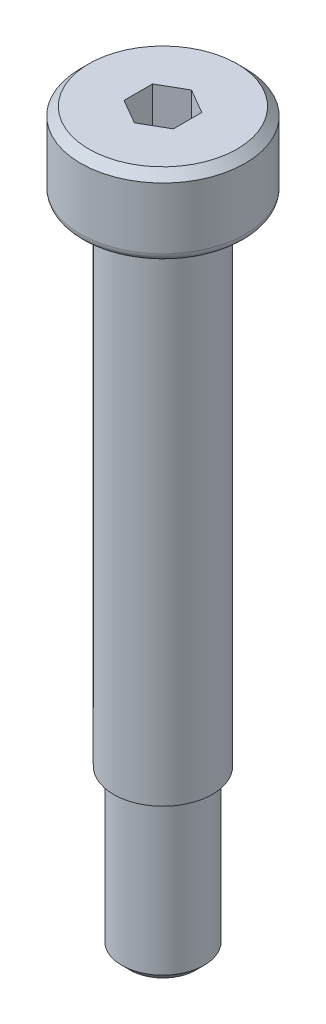
ISO-10303-21;
HEADER;
FILE_DESCRIPTION(('STEP AP214'),'2;1');
FILE_NAME('part.step','',(''),(''),'','','');
FILE_SCHEMA(('AUTOMOTIVE_DESIGN { 1 0 10303 214 1 1 1 1 }'));
ENDSEC;
DATA;
#1=APPLICATION_CONTEXT('core data for automotive mechanical design processes');
#2=APPLICATION_PROTOCOL_DEFINITION('international standard','automotive_design',2000,#1);
#3=PRODUCT_CONTEXT('',#1,'mechanical');
#4=PRODUCT('Part','Part','',(#3));
#5=PRODUCT_RELATED_PRODUCT_CATEGORY('part','',(#4));
#6=PRODUCT_DEFINITION_FORMATION('','',#4);
#7=PRODUCT_DEFINITION_CONTEXT('part definition',#1,'design');
#8=PRODUCT_DEFINITION('design','',#6,#7);
#9=PRODUCT_DEFINITION_SHAPE('','',#8);
#10=(LENGTH_UNIT() NAMED_UNIT(*) SI_UNIT(.MILLI.,.METRE.));
#11=(NAMED_UNIT(*) PLANE_ANGLE_UNIT() SI_UNIT($,.RADIAN.));
#12=(NAMED_UNIT(*) SI_UNIT($,.STERADIAN.) SOLID_ANGLE_UNIT());
#13=UNCERTAINTY_MEASURE_WITH_UNIT(LENGTH_MEASURE(1.E-05),#10,'distance_accuracy_value','');
#14=(GEOMETRIC_REPRESENTATION_CONTEXT(3) GLOBAL_UNCERTAINTY_ASSIGNED_CONTEXT((#13)) GLOBAL_UNIT_ASSIGNED_CONTEXT((#10,
#11,#12)) REPRESENTATION_CONTEXT('',''));
#15=CARTESIAN_POINT('',(0.,0.,0.));
#16=DIRECTION('',(0.,0.,1.));
#17=DIRECTION('',(1.,0.,0.));
#18=AXIS2_PLACEMENT_3D('',#15,#16,#17);
#19=CARTESIAN_POINT('',(0.,0.,0.));
#20=DIRECTION('',(0.,-1.,0.));
#21=DIRECTION('',(1.,0.,0.));
#22=AXIS2_PLACEMENT_3D('',#19,#20,#21);
#23=PLANE('',#22);
#24=CARTESIAN_POINT('',(0.,0.,0.));
#25=DIRECTION('',(0.,-1.,0.));
#26=DIRECTION('',(1.,0.,0.));
#27=AXIS2_PLACEMENT_3D('',#24,#25,#26);
#28=CIRCLE('',#27,4.49999999999999);
#29=CARTESIAN_POINT('',(4.49999999999999,0.,0.));
#30=VERTEX_POINT('',#29);
#31=EDGE_CURVE('E165',#30,#30,#28,.F.);
#32=ORIENTED_EDGE('',*,*,#31,.T.);
#33=EDGE_LOOP('',(#32));
#34=FACE_BOUND('',#33,.T.);
#35=DIRECTION('',(0.866025403784438,0.,-0.5));
#36=VECTOR('',#35,1.);
#37=CARTESIAN_POINT('',(0.,0.,1.73205080756888));
#38=LINE('',#37,#36);
#39=CARTESIAN_POINT('',(0.,0.,1.73205080756888));
#40=VERTEX_POINT('',#39);
#41=CARTESIAN_POINT('',(1.5,0.,0.866025403784439));
#42=VERTEX_POINT('',#41);
#43=EDGE_CURVE('E132',#40,#42,#38,.T.);
#44=ORIENTED_EDGE('',*,*,#43,.F.);
#45=DIRECTION('',(0.866025403784438,0.,0.5));
#46=VECTOR('',#45,1.);
#47=CARTESIAN_POINT('',(-1.5,0.,0.866025403784439));
#48=LINE('',#47,#46);
#49=CARTESIAN_POINT('',(-1.5,0.,0.866025403784439));
#50=VERTEX_POINT('',#49);
#51=EDGE_CURVE('E58',#50,#40,#48,.T.);
#52=ORIENTED_EDGE('',*,*,#51,.F.);
#53=DIRECTION('',(0.,0.,1.));
#54=VECTOR('',#53,1.);
#55=CARTESIAN_POINT('',(-1.5,0.,-0.866025403784439));
#56=LINE('',#55,#54);
#57=CARTESIAN_POINT('',(-1.5,0.,-0.866025403784439));
#58=VERTEX_POINT('',#57);
#59=EDGE_CURVE('E141',#58,#50,#56,.T.);
#60=ORIENTED_EDGE('',*,*,#59,.F.);
#61=DIRECTION('',(-0.866025403784439,0.,0.5));
#62=VECTOR('',#61,1.);
#63=CARTESIAN_POINT('',(0.,0.,-1.73205080756888));
#64=LINE('',#63,#62);
#65=CARTESIAN_POINT('',(0.,0.,-1.73205080756888));
#66=VERTEX_POINT('',#65);
#67=EDGE_CURVE('E139',#66,#58,#64,.T.);
#68=ORIENTED_EDGE('',*,*,#67,.F.);
#69=DIRECTION('',(-0.866025403784439,0.,-0.5));
#70=VECTOR('',#69,1.);
#71=CARTESIAN_POINT('',(1.5,0.,-0.86602540378444));
#72=LINE('',#71,#70);
#73=CARTESIAN_POINT('',(1.5,0.,-0.86602540378444));
#74=VERTEX_POINT('',#73);
#75=EDGE_CURVE('E106',#74,#66,#72,.T.);
#76=ORIENTED_EDGE('',*,*,#75,.F.);
#77=DIRECTION('',(0.,0.,-1.));
#78=VECTOR('',#77,1.);
#79=CARTESIAN_POINT('',(1.5,0.,0.866025403784439));
#80=LINE('',#79,#78);
#81=EDGE_CURVE('E135',#42,#74,#80,.T.);
#82=ORIENTED_EDGE('',*,*,#81,.F.);
#83=EDGE_LOOP('',(#44,#52,#60,#68,#76,#82));
#84=FACE_BOUND('',#83,.T.);
#85=ADVANCED_FACE('F42',(#34,#84),#23,.F.);
#86=CARTESIAN_POINT('',(0.,5.,0.));
#87=DIRECTION('',(0.,1.,0.));
#88=DIRECTION('',(-1.,0.,0.));
#89=AXIS2_PLACEMENT_3D('',#86,#87,#88);
#90=CYLINDRICAL_SURFACE('',#89,5.);
#91=CARTESIAN_POINT('',(0.,-4.23,0.));
#92=DIRECTION('',(0.,1.,0.));
#93=DIRECTION('',(-1.,0.,0.));
#94=AXIS2_PLACEMENT_3D('',#91,#92,#93);
#95=CIRCLE('',#94,5.);
#96=CARTESIAN_POINT('',(-5.,-4.23,0.));
#97=VERTEX_POINT('',#96);
#98=EDGE_CURVE('E171',#97,#97,#95,.T.);
#99=ORIENTED_EDGE('',*,*,#98,.T.);
#100=EDGE_LOOP('',(#99));
#101=FACE_BOUND('',#100,.T.);
#102=CARTESIAN_POINT('',(0.,-0.500000000000005,0.));
#103=DIRECTION('',(0.,-1.,0.));
#104=DIRECTION('',(1.,0.,0.));
#105=AXIS2_PLACEMENT_3D('',#102,#103,#104);
#106=CIRCLE('',#105,5.);
#107=CARTESIAN_POINT('',(5.,-0.500000000000004,0.));
#108=VERTEX_POINT('',#107);
#109=EDGE_CURVE('E168',#108,#108,#106,.T.);
#110=ORIENTED_EDGE('',*,*,#109,.T.);
#111=EDGE_LOOP('',(#110));
#112=FACE_BOUND('',#111,.T.);
#113=ADVANCED_FACE('F193',(#101,#112),#90,.T.);
#114=CARTESIAN_POINT('',(5.,-4.73,0.));
#115=DIRECTION('',(0.,1.,0.));
#116=DIRECTION('',(-1.,0.,0.));
#117=AXIS2_PLACEMENT_3D('',#114,#115,#116);
#118=PLANE('',#117);
#119=CARTESIAN_POINT('',(0.,-4.73,0.));
#120=DIRECTION('',(0.,1.,0.));
#121=DIRECTION('',(-1.,0.,0.));
#122=AXIS2_PLACEMENT_3D('',#119,#120,#121);
#123=CIRCLE('',#122,4.5);
#124=CARTESIAN_POINT('',(-4.5,-4.73,0.));
#125=VERTEX_POINT('',#124);
#126=EDGE_CURVE('E174',#125,#125,#123,.F.);
#127=ORIENTED_EDGE('',*,*,#126,.T.);
#128=EDGE_LOOP('',(#127));
#129=FACE_BOUND('',#128,.T.);
#130=CARTESIAN_POINT('',(0.,-4.73,0.));
#131=DIRECTION('',(0.,1.,0.));
#132=DIRECTION('',(-1.,0.,0.));
#133=AXIS2_PLACEMENT_3D('',#130,#131,#132);
#134=CIRCLE('',#133,2.75);
#135=CARTESIAN_POINT('',(-2.75,-4.73,0.));
#136=VERTEX_POINT('',#135);
#137=EDGE_CURVE('E162',#136,#136,#134,.T.);
#138=ORIENTED_EDGE('',*,*,#137,.T.);
#139=EDGE_LOOP('',(#138));
#140=FACE_BOUND('',#139,.T.);
#141=ADVANCED_FACE('F201',(#129,#140),#118,.F.);
#142=CARTESIAN_POINT('',(0.,5.,0.));
#143=DIRECTION('',(0.,1.,0.));
#144=DIRECTION('',(-1.,0.,0.));
#145=AXIS2_PLACEMENT_3D('',#142,#143,#144);
#146=CYLINDRICAL_SURFACE('',#145,2.75);
#147=ORIENTED_EDGE('',*,*,#137,.F.);
#148=EDGE_LOOP('',(#147));
#149=FACE_BOUND('',#148,.T.);
#150=CARTESIAN_POINT('',(0.,-5.23,0.));
#151=DIRECTION('',(0.,1.,0.));
#152=DIRECTION('',(-1.,0.,0.));
#153=AXIS2_PLACEMENT_3D('',#150,#151,#152);
#154=CIRCLE('',#153,2.75);
#155=CARTESIAN_POINT('',(-2.75,-5.23,0.));
#156=VERTEX_POINT('',#155);
#157=EDGE_CURVE('E159',#156,#156,#154,.T.);
#158=ORIENTED_EDGE('',*,*,#157,.T.);
#159=EDGE_LOOP('',(#158));
#160=FACE_BOUND('',#159,.T.);
#161=ADVANCED_FACE('F255',(#149,#160),#146,.T.);
#162=CARTESIAN_POINT('',(2.75,-5.23,0.));
#163=DIRECTION('',(0.,-1.,0.));
#164=DIRECTION('',(1.,0.,0.));
#165=AXIS2_PLACEMENT_3D('',#162,#163,#164);
#166=PLANE('',#165);
#167=ORIENTED_EDGE('',*,*,#157,.F.);
#168=EDGE_LOOP('',(#167));
#169=FACE_BOUND('',#168,.T.);
#170=CARTESIAN_POINT('',(0.,-5.23,0.));
#171=DIRECTION('',(0.,1.,0.));
#172=DIRECTION('',(-1.,0.,0.));
#173=AXIS2_PLACEMENT_3D('',#170,#171,#172);
#174=CIRCLE('',#173,3.);
#175=CARTESIAN_POINT('',(-3.,-5.23,0.));
#176=VERTEX_POINT('',#175);
#177=EDGE_CURVE('E156',#176,#176,#174,.T.);
#178=ORIENTED_EDGE('',*,*,#177,.T.);
#179=EDGE_LOOP('',(#178));
#180=FACE_BOUND('',#179,.T.);
#181=ADVANCED_FACE('F251',(#169,#180),#166,.F.);
#182=CARTESIAN_POINT('',(0.,5.,0.));
#183=DIRECTION('',(0.,1.,0.));
#184=DIRECTION('',(-1.,0.,0.));
#185=AXIS2_PLACEMENT_3D('',#182,#183,#184);
#186=CYLINDRICAL_SURFACE('',#185,3.);
#187=ORIENTED_EDGE('',*,*,#177,.F.);
#188=EDGE_LOOP('',(#187));
#189=FACE_BOUND('',#188,.T.);
#190=CARTESIAN_POINT('',(0.,-34.73,0.));
#191=DIRECTION('',(0.,1.,0.));
#192=DIRECTION('',(-1.,0.,0.));
#193=AXIS2_PLACEMENT_3D('',#190,#191,#192);
#194=CIRCLE('',#193,3.00000000000001);
#195=CARTESIAN_POINT('',(-3.,-34.73,0.));
#196=VERTEX_POINT('',#195);
#197=EDGE_CURVE('E153',#196,#196,#194,.T.);
#198=ORIENTED_EDGE('',*,*,#197,.T.);
#199=EDGE_LOOP('',(#198));
#200=FACE_BOUND('',#199,.T.);
#201=ADVANCED_FACE('F247',(#189,#200),#186,.T.);
#202=CARTESIAN_POINT('',(3.00000000000001,-34.73,0.));
#203=DIRECTION('',(0.,1.,0.));
#204=DIRECTION('',(-1.,0.,0.));
#205=AXIS2_PLACEMENT_3D('',#202,#203,#204);
#206=PLANE('',#205);
#207=ORIENTED_EDGE('',*,*,#197,.F.);
#208=EDGE_LOOP('',(#207));
#209=FACE_BOUND('',#208,.T.);
#210=CARTESIAN_POINT('',(0.,-34.73,0.));
#211=DIRECTION('',(0.,1.,0.));
#212=DIRECTION('',(-1.,0.,0.));
#213=AXIS2_PLACEMENT_3D('',#210,#211,#212);
#214=CIRCLE('',#213,2.5);
#215=CARTESIAN_POINT('',(-2.49999999999999,-34.73,0.));
#216=VERTEX_POINT('',#215);
#217=EDGE_CURVE('E145',#216,#216,#214,.T.);
#218=ORIENTED_EDGE('',*,*,#217,.T.);
#219=EDGE_LOOP('',(#218));
#220=FACE_BOUND('',#219,.T.);
#221=ADVANCED_FACE('F244',(#209,#220),#206,.F.);
#222=CARTESIAN_POINT('',(0.,5.,0.));
#223=DIRECTION('',(0.,1.,0.));
#224=DIRECTION('',(-1.,0.,0.));
#225=AXIS2_PLACEMENT_3D('',#222,#223,#224);
#226=CYLINDRICAL_SURFACE('',#225,2.5);
#227=CARTESIAN_POINT('',(0.,-43.98,0.));
#228=DIRECTION('',(0.,1.,0.));
#229=DIRECTION('',(-1.,0.,0.));
#230=AXIS2_PLACEMENT_3D('',#227,#228,#229);
#231=CIRCLE('',#230,2.5);
#232=CARTESIAN_POINT('',(-2.49999999999999,-43.98,0.));
#233=VERTEX_POINT('',#232);
#234=EDGE_CURVE('E51',#233,#233,#231,.T.);
#235=ORIENTED_EDGE('',*,*,#234,.T.);
#236=EDGE_LOOP('',(#235));
#237=FACE_BOUND('',#236,.T.);
#238=ORIENTED_EDGE('',*,*,#217,.F.);
#239=EDGE_LOOP('',(#238));
#240=FACE_BOUND('',#239,.T.);
#241=ADVANCED_FACE('F179',(#237,#240),#226,.T.);
#242=CARTESIAN_POINT('',(2.50000000000001,-44.48,0.));
#243=DIRECTION('',(0.,1.,0.));
#244=DIRECTION('',(-1.,0.,0.));
#245=AXIS2_PLACEMENT_3D('',#242,#243,#244);
#246=PLANE('',#245);
#247=CARTESIAN_POINT('',(0.,-44.48,0.));
#248=DIRECTION('',(0.,1.,0.));
#249=DIRECTION('',(-1.,0.,0.));
#250=AXIS2_PLACEMENT_3D('',#247,#248,#249);
#251=CIRCLE('',#250,1.99999999999999);
#252=CARTESIAN_POINT('',(-1.99999999999998,-44.48,0.));
#253=VERTEX_POINT('',#252);
#254=EDGE_CURVE('E11',#253,#253,#251,.F.);
#255=ORIENTED_EDGE('',*,*,#254,.T.);
#256=EDGE_LOOP('',(#255));
#257=FACE_BOUND('',#256,.T.);
#258=ADVANCED_FACE('F239',(#257),#246,.F.);
#259=CARTESIAN_POINT('',(-1.5,-2.4,0.866025403784439));
#260=DIRECTION('',(-0.5,0.,0.866025403784439));
#261=DIRECTION('',(0.866025403784439,0.,0.5));
#262=AXIS2_PLACEMENT_3D('',#259,#260,#261);
#263=PLANE('',#262);
#264=ORIENTED_EDGE('',*,*,#51,.T.);
#265=DIRECTION('',(0.,1.,0.));
#266=VECTOR('',#265,1.);
#267=CARTESIAN_POINT('',(0.,-2.4,1.73205080756888));
#268=LINE('',#267,#266);
#269=CARTESIAN_POINT('',(0.,-2.4,1.73205080756888));
#270=VERTEX_POINT('',#269);
#271=EDGE_CURVE('E88',#270,#40,#268,.T.);
#272=ORIENTED_EDGE('',*,*,#271,.F.);
#273=DIRECTION('',(0.866025403784438,0.,0.5));
#274=VECTOR('',#273,1.);
#275=CARTESIAN_POINT('',(-1.5,-2.4,0.866025403784439));
#276=LINE('',#275,#274);
#277=CARTESIAN_POINT('',(-1.5,-2.4,0.866025403784439));
#278=VERTEX_POINT('',#277);
#279=EDGE_CURVE('E143',#278,#270,#276,.T.);
#280=ORIENTED_EDGE('',*,*,#279,.F.);
#281=DIRECTION('',(0.,1.,0.));
#282=VECTOR('',#281,1.);
#283=CARTESIAN_POINT('',(-1.5,-2.4,0.866025403784439));
#284=LINE('',#283,#282);
#285=EDGE_CURVE('E66',#278,#50,#284,.T.);
#286=ORIENTED_EDGE('',*,*,#285,.T.);
#287=EDGE_LOOP('',(#264,#272,#280,#286));
#288=FACE_BOUND('',#287,.T.);
#289=ADVANCED_FACE('F229',(#288),#263,.F.);
#290=CARTESIAN_POINT('',(-1.5,-2.4,-0.866025403784439));
#291=DIRECTION('',(-1.,0.,0.));
#292=DIRECTION('',(0.,0.,1.));
#293=AXIS2_PLACEMENT_3D('',#290,#291,#292);
#294=PLANE('',#293);
#295=ORIENTED_EDGE('',*,*,#59,.T.);
#296=ORIENTED_EDGE('',*,*,#285,.F.);
#297=DIRECTION('',(0.,0.,1.));
#298=VECTOR('',#297,1.);
#299=CARTESIAN_POINT('',(-1.5,-2.4,-0.866025403784439));
#300=LINE('',#299,#298);
#301=CARTESIAN_POINT('',(-1.5,-2.4,-0.866025403784439));
#302=VERTEX_POINT('',#301);
#303=EDGE_CURVE('E118',#302,#278,#300,.T.);
#304=ORIENTED_EDGE('',*,*,#303,.F.);
#305=DIRECTION('',(0.,1.,0.));
#306=VECTOR('',#305,1.);
#307=CARTESIAN_POINT('',(-1.5,-2.4,-0.866025403784439));
#308=LINE('',#307,#306);
#309=EDGE_CURVE('E110',#302,#58,#308,.T.);
#310=ORIENTED_EDGE('',*,*,#309,.T.);
#311=EDGE_LOOP('',(#295,#296,#304,#310));
#312=FACE_BOUND('',#311,.T.);
#313=ADVANCED_FACE('F226',(#312),#294,.F.);
#314=CARTESIAN_POINT('',(0.,-2.4,-1.73205080756888));
#315=DIRECTION('',(-0.5,0.,-0.866025403784439));
#316=DIRECTION('',(-0.866025403784439,0.,0.5));
#317=AXIS2_PLACEMENT_3D('',#314,#315,#316);
#318=PLANE('',#317);
#319=ORIENTED_EDGE('',*,*,#67,.T.);
#320=ORIENTED_EDGE('',*,*,#309,.F.);
#321=DIRECTION('',(-0.866025403784439,0.,0.5));
#322=VECTOR('',#321,1.);
#323=CARTESIAN_POINT('',(0.,-2.4,-1.73205080756888));
#324=LINE('',#323,#322);
#325=CARTESIAN_POINT('',(0.,-2.4,-1.73205080756888));
#326=VERTEX_POINT('',#325);
#327=EDGE_CURVE('E114',#326,#302,#324,.T.);
#328=ORIENTED_EDGE('',*,*,#327,.F.);
#329=DIRECTION('',(0.,1.,0.));
#330=VECTOR('',#329,1.);
#331=CARTESIAN_POINT('',(0.,-2.4,-1.73205080756888));
#332=LINE('',#331,#330);
#333=EDGE_CURVE('E99',#326,#66,#332,.T.);
#334=ORIENTED_EDGE('',*,*,#333,.T.);
#335=EDGE_LOOP('',(#319,#320,#328,#334));
#336=FACE_BOUND('',#335,.T.);
#337=ADVANCED_FACE('F115',(#336),#318,.F.);
#338=CARTESIAN_POINT('',(1.5,-2.4,-0.86602540378444));
#339=DIRECTION('',(0.5,0.,-0.866025403784439));
#340=DIRECTION('',(-0.866025403784439,0.,-0.5));
#341=AXIS2_PLACEMENT_3D('',#338,#339,#340);
#342=PLANE('',#341);
#343=ORIENTED_EDGE('',*,*,#75,.T.);
#344=ORIENTED_EDGE('',*,*,#333,.F.);
#345=DIRECTION('',(-0.866025403784439,0.,-0.5));
#346=VECTOR('',#345,1.);
#347=CARTESIAN_POINT('',(1.5,-2.4,-0.86602540378444));
#348=LINE('',#347,#346);
#349=CARTESIAN_POINT('',(1.5,-2.4,-0.86602540378444));
#350=VERTEX_POINT('',#349);
#351=EDGE_CURVE('E103',#350,#326,#348,.T.);
#352=ORIENTED_EDGE('',*,*,#351,.F.);
#353=DIRECTION('',(0.,1.,0.));
#354=VECTOR('',#353,1.);
#355=CARTESIAN_POINT('',(1.5,-2.4,-0.86602540378444));
#356=LINE('',#355,#354);
#357=EDGE_CURVE('E111',#350,#74,#356,.T.);
#358=ORIENTED_EDGE('',*,*,#357,.T.);
#359=EDGE_LOOP('',(#343,#344,#352,#358));
#360=FACE_BOUND('',#359,.T.);
#361=ADVANCED_FACE('F101',(#360),#342,.F.);
#362=CARTESIAN_POINT('',(1.5,-2.4,0.866025403784439));
#363=DIRECTION('',(1.,0.,0.));
#364=DIRECTION('',(0.,1.,0.));
#365=AXIS2_PLACEMENT_3D('',#362,#363,#364);
#366=PLANE('',#365);
#367=ORIENTED_EDGE('',*,*,#81,.T.);
#368=ORIENTED_EDGE('',*,*,#357,.F.);
#369=DIRECTION('',(0.,0.,-1.));
#370=VECTOR('',#369,1.);
#371=CARTESIAN_POINT('',(1.5,-2.4,0.866025403784439));
#372=LINE('',#371,#370);
#373=CARTESIAN_POINT('',(1.5,-2.4,0.866025403784439));
#374=VERTEX_POINT('',#373);
#375=EDGE_CURVE('E124',#374,#350,#372,.T.);
#376=ORIENTED_EDGE('',*,*,#375,.F.);
#377=DIRECTION('',(0.,1.,0.));
#378=VECTOR('',#377,1.);
#379=CARTESIAN_POINT('',(1.5,-2.4,0.866025403784439));
#380=LINE('',#379,#378);
#381=EDGE_CURVE('E148',#374,#42,#380,.T.);
#382=ORIENTED_EDGE('',*,*,#381,.T.);
#383=EDGE_LOOP('',(#367,#368,#376,#382));
#384=FACE_BOUND('',#383,.T.);
#385=ADVANCED_FACE('F222',(#384),#366,.F.);
#386=CARTESIAN_POINT('',(0.,-2.4,1.73205080756888));
#387=DIRECTION('',(0.5,0.,0.866025403784438));
#388=DIRECTION('',(0.866025403784439,0.,-0.5));
#389=AXIS2_PLACEMENT_3D('',#386,#387,#388);
#390=PLANE('',#389);
#391=ORIENTED_EDGE('',*,*,#43,.T.);
#392=ORIENTED_EDGE('',*,*,#381,.F.);
#393=DIRECTION('',(0.866025403784438,0.,-0.5));
#394=VECTOR('',#393,1.);
#395=CARTESIAN_POINT('',(0.,-2.4,1.73205080756888));
#396=LINE('',#395,#394);
#397=EDGE_CURVE('E126',#270,#374,#396,.T.);
#398=ORIENTED_EDGE('',*,*,#397,.F.);
#399=ORIENTED_EDGE('',*,*,#271,.T.);
#400=EDGE_LOOP('',(#391,#392,#398,#399));
#401=FACE_BOUND('',#400,.T.);
#402=ADVANCED_FACE('F213',(#401),#390,.F.);
#403=CARTESIAN_POINT('',(0.,-2.4,0.));
#404=DIRECTION('',(0.,1.,0.));
#405=DIRECTION('',(-1.,0.,0.));
#406=AXIS2_PLACEMENT_3D('',#403,#404,#405);
#407=PLANE('',#406);
#408=ORIENTED_EDGE('',*,*,#279,.T.);
#409=ORIENTED_EDGE('',*,*,#397,.T.);
#410=ORIENTED_EDGE('',*,*,#375,.T.);
#411=ORIENTED_EDGE('',*,*,#351,.T.);
#412=ORIENTED_EDGE('',*,*,#327,.T.);
#413=ORIENTED_EDGE('',*,*,#303,.T.);
#414=EDGE_LOOP('',(#408,#409,#410,#411,#412,#413));
#415=FACE_BOUND('',#414,.T.);
#416=ADVANCED_FACE('F121',(#415),#407,.T.);
#417=CARTESIAN_POINT('',(0.,0.,0.));
#418=DIRECTION('',(0.,-1.,0.));
#419=DIRECTION('',(1.,0.,0.));
#420=AXIS2_PLACEMENT_3D('',#417,#418,#419);
#421=CONICAL_SURFACE('',#420,4.49999999999999,0.785398163397452);
#422=ORIENTED_EDGE('',*,*,#109,.F.);
#423=EDGE_LOOP('',(#422));
#424=FACE_BOUND('',#423,.T.);
#425=ORIENTED_EDGE('',*,*,#31,.F.);
#426=EDGE_LOOP('',(#425));
#427=FACE_BOUND('',#426,.T.);
#428=ADVANCED_FACE('F189',(#424,#427),#421,.T.);
#429=CARTESIAN_POINT('',(0.,-4.23,0.));
#430=DIRECTION('',(0.,1.,0.));
#431=DIRECTION('',(-1.,0.,0.));
#432=AXIS2_PLACEMENT_3D('',#429,#430,#431);
#433=TOROIDAL_SURFACE('',#432,4.5,0.5);
#434=ORIENTED_EDGE('',*,*,#126,.F.);
#435=EDGE_LOOP('',(#434));
#436=FACE_BOUND('',#435,.T.);
#437=ORIENTED_EDGE('',*,*,#98,.F.);
#438=EDGE_LOOP('',(#437));
#439=FACE_BOUND('',#438,.T.);
#440=ADVANCED_FACE('F183',(#436,#439),#433,.T.);
#441=CARTESIAN_POINT('',(0.,-43.98,0.));
#442=DIRECTION('',(0.,1.,0.));
#443=DIRECTION('',(-1.,0.,0.));
#444=AXIS2_PLACEMENT_3D('',#441,#442,#443);
#445=CONICAL_SURFACE('',#444,2.5,0.785398163397447);
#446=ORIENTED_EDGE('',*,*,#254,.F.);
#447=EDGE_LOOP('',(#446));
#448=FACE_BOUND('',#447,.T.);
#449=ORIENTED_EDGE('',*,*,#234,.F.);
#450=EDGE_LOOP('',(#449));
#451=FACE_BOUND('',#450,.T.);
#452=ADVANCED_FACE('F45',(#448,#451),#445,.T.);
#453=CLOSED_SHELL('',(#85,#113,#141,#161,#181,#201,#221,#241,#258,#289,#313,#337,#361,#385,#402,
#416,#428,#440,#452));
#454=MANIFOLD_SOLID_BREP('B2',#453);
#455=ADVANCED_BREP_SHAPE_REPRESENTATION('',(#18,#454),#14);
#456=SHAPE_DEFINITION_REPRESENTATION(#9,#455);
ENDSEC;
END-ISO-10303-21;
